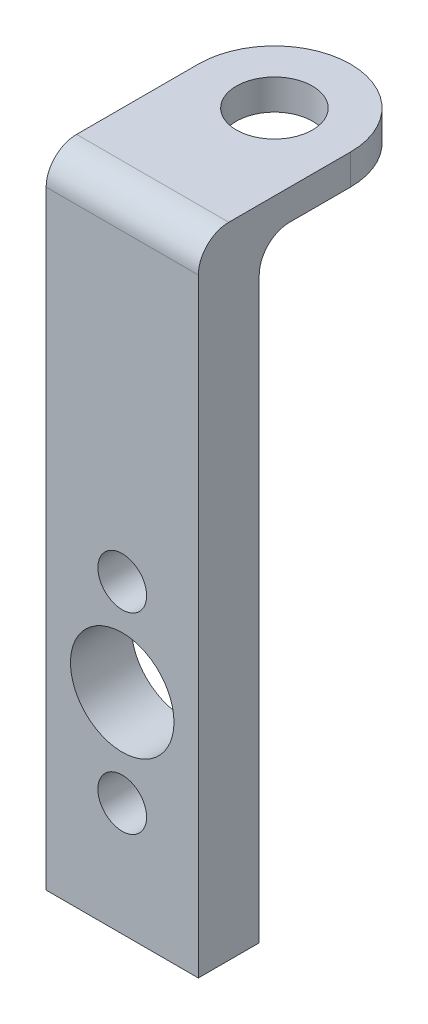
ISO-10303-21;
HEADER;
FILE_DESCRIPTION(('STEP AP214'),'2;1');
FILE_NAME('part.step','',(''),(''),'','','');
FILE_SCHEMA(('AUTOMOTIVE_DESIGN { 1 0 10303 214 1 1 1 1 }'));
ENDSEC;
DATA;
#1=APPLICATION_CONTEXT('core data for automotive mechanical design processes');
#2=APPLICATION_PROTOCOL_DEFINITION('international standard','automotive_design',2000,#1);
#3=PRODUCT_CONTEXT('',#1,'mechanical');
#4=PRODUCT('Part','Part','',(#3));
#5=PRODUCT_RELATED_PRODUCT_CATEGORY('part','',(#4));
#6=PRODUCT_DEFINITION_FORMATION('','',#4);
#7=PRODUCT_DEFINITION_CONTEXT('part definition',#1,'design');
#8=PRODUCT_DEFINITION('design','',#6,#7);
#9=PRODUCT_DEFINITION_SHAPE('','',#8);
#10=(LENGTH_UNIT() NAMED_UNIT(*) SI_UNIT(.MILLI.,.METRE.));
#11=(NAMED_UNIT(*) PLANE_ANGLE_UNIT() SI_UNIT($,.RADIAN.));
#12=(NAMED_UNIT(*) SI_UNIT($,.STERADIAN.) SOLID_ANGLE_UNIT());
#13=UNCERTAINTY_MEASURE_WITH_UNIT(LENGTH_MEASURE(1.E-05),#10,'distance_accuracy_value','');
#14=(GEOMETRIC_REPRESENTATION_CONTEXT(3) GLOBAL_UNCERTAINTY_ASSIGNED_CONTEXT((#13)) GLOBAL_UNIT_ASSIGNED_CONTEXT((#10,
#11,#12)) REPRESENTATION_CONTEXT('',''));
#15=CARTESIAN_POINT('',(0.,0.,0.));
#16=DIRECTION('',(0.,0.,1.));
#17=DIRECTION('',(1.,0.,0.));
#18=AXIS2_PLACEMENT_3D('',#15,#16,#17);
#19=CARTESIAN_POINT('',(0.,2.54,0.));
#20=DIRECTION('',(0.,-1.,0.));
#21=DIRECTION('',(0.,0.,-1.));
#22=AXIS2_PLACEMENT_3D('',#19,#20,#21);
#23=PLANE('',#22);
#24=DIRECTION('',(0.,0.,1.));
#25=VECTOR('',#24,1.);
#26=CARTESIAN_POINT('',(-6.35,2.54,0.));
#27=LINE('',#26,#25);
#28=CARTESIAN_POINT('',(-6.35,2.54,0.));
#29=VERTEX_POINT('',#28);
#30=CARTESIAN_POINT('',(-6.35,2.54,10.16));
#31=VERTEX_POINT('',#30);
#32=EDGE_CURVE('E178',#29,#31,#27,.T.);
#33=ORIENTED_EDGE('',*,*,#32,.T.);
#34=DIRECTION('',(1.,0.,0.));
#35=VECTOR('',#34,1.);
#36=CARTESIAN_POINT('',(0.,2.54,10.16));
#37=LINE('',#36,#35);
#38=CARTESIAN_POINT('',(6.35,2.54,10.16));
#39=VERTEX_POINT('',#38);
#40=EDGE_CURVE('E136',#31,#39,#37,.T.);
#41=ORIENTED_EDGE('',*,*,#40,.T.);
#42=DIRECTION('',(0.,0.,-1.));
#43=VECTOR('',#42,1.);
#44=CARTESIAN_POINT('',(6.35,2.54,0.));
#45=LINE('',#44,#43);
#46=CARTESIAN_POINT('',(6.35,2.54,0.));
#47=VERTEX_POINT('',#46);
#48=EDGE_CURVE('E163',#39,#47,#45,.T.);
#49=ORIENTED_EDGE('',*,*,#48,.T.);
#50=CARTESIAN_POINT('',(0.,2.54,0.));
#51=DIRECTION('',(0.,1.,0.));
#52=DIRECTION('',(0.,0.,-1.));
#53=AXIS2_PLACEMENT_3D('',#50,#51,#52);
#54=CIRCLE('',#53,6.35);
#55=EDGE_CURVE('E151',#47,#29,#54,.T.);
#56=ORIENTED_EDGE('',*,*,#55,.T.);
#57=EDGE_LOOP('',(#33,#41,#49,#56));
#58=FACE_BOUND('',#57,.T.);
#59=CARTESIAN_POINT('',(0.,2.54,0.));
#60=DIRECTION('',(0.,1.,0.));
#61=DIRECTION('',(0.,0.,1.));
#62=AXIS2_PLACEMENT_3D('',#59,#60,#61);
#63=CIRCLE('',#62,3.175);
#64=CARTESIAN_POINT('',(0.,2.54,3.175));
#65=VERTEX_POINT('',#64);
#66=EDGE_CURVE('E128',#65,#65,#63,.T.);
#67=ORIENTED_EDGE('',*,*,#66,.F.);
#68=EDGE_LOOP('',(#67));
#69=FACE_BOUND('',#68,.T.);
#70=ADVANCED_FACE('F35',(#58,#69),#23,.F.);
#71=CARTESIAN_POINT('',(0.,0.,0.));
#72=DIRECTION('',(0.,-1.,0.));
#73=DIRECTION('',(0.,0.,-1.));
#74=AXIS2_PLACEMENT_3D('',#71,#72,#73);
#75=PLANE('',#74);
#76=DIRECTION('',(0.,0.,-1.));
#77=VECTOR('',#76,1.);
#78=CARTESIAN_POINT('',(6.35,0.,0.));
#79=LINE('',#78,#77);
#80=CARTESIAN_POINT('',(6.35,0.,5.08));
#81=VERTEX_POINT('',#80);
#82=CARTESIAN_POINT('',(6.35,0.,0.));
#83=VERTEX_POINT('',#82);
#84=EDGE_CURVE('E148',#81,#83,#79,.T.);
#85=ORIENTED_EDGE('',*,*,#84,.F.);
#86=DIRECTION('',(1.,0.,0.));
#87=VECTOR('',#86,1.);
#88=CARTESIAN_POINT('',(0.,0.,5.08));
#89=LINE('',#88,#87);
#90=CARTESIAN_POINT('',(-6.35,0.,5.08));
#91=VERTEX_POINT('',#90);
#92=EDGE_CURVE('E58',#81,#91,#89,.F.);
#93=ORIENTED_EDGE('',*,*,#92,.T.);
#94=DIRECTION('',(0.,0.,1.));
#95=VECTOR('',#94,1.);
#96=CARTESIAN_POINT('',(-6.35,0.,0.));
#97=LINE('',#96,#95);
#98=CARTESIAN_POINT('',(-6.35,0.,0.));
#99=VERTEX_POINT('',#98);
#100=EDGE_CURVE('E152',#99,#91,#97,.T.);
#101=ORIENTED_EDGE('',*,*,#100,.F.);
#102=CARTESIAN_POINT('',(0.,0.,0.));
#103=DIRECTION('',(0.,1.,0.));
#104=DIRECTION('',(0.,0.,-1.));
#105=AXIS2_PLACEMENT_3D('',#102,#103,#104);
#106=CIRCLE('',#105,6.35);
#107=EDGE_CURVE('E169',#83,#99,#106,.T.);
#108=ORIENTED_EDGE('',*,*,#107,.F.);
#109=EDGE_LOOP('',(#85,#93,#101,#108));
#110=FACE_BOUND('',#109,.T.);
#111=CARTESIAN_POINT('',(0.,0.,0.));
#112=DIRECTION('',(0.,1.,0.));
#113=DIRECTION('',(0.,0.,1.));
#114=AXIS2_PLACEMENT_3D('',#111,#112,#113);
#115=CIRCLE('',#114,3.175);
#116=CARTESIAN_POINT('',(0.,0.,3.175));
#117=VERTEX_POINT('',#116);
#118=EDGE_CURVE('E125',#117,#117,#115,.T.);
#119=ORIENTED_EDGE('',*,*,#118,.T.);
#120=EDGE_LOOP('',(#119));
#121=FACE_BOUND('',#120,.T.);
#122=ADVANCED_FACE('F212',(#110,#121),#75,.T.);
#123=CARTESIAN_POINT('',(0.,2.54,0.));
#124=DIRECTION('',(0.,-1.,0.));
#125=DIRECTION('',(0.,0.,-1.));
#126=AXIS2_PLACEMENT_3D('',#123,#124,#125);
#127=CYLINDRICAL_SURFACE('',#126,6.35);
#128=ORIENTED_EDGE('',*,*,#107,.T.);
#129=DIRECTION('',(0.,-1.,0.));
#130=VECTOR('',#129,1.);
#131=CARTESIAN_POINT('',(-6.35,2.54,0.));
#132=LINE('',#131,#130);
#133=EDGE_CURVE('E140',#29,#99,#132,.T.);
#134=ORIENTED_EDGE('',*,*,#133,.F.);
#135=ORIENTED_EDGE('',*,*,#55,.F.);
#136=DIRECTION('',(0.,-1.,0.));
#137=VECTOR('',#136,1.);
#138=CARTESIAN_POINT('',(6.35,2.54,0.));
#139=LINE('',#138,#137);
#140=EDGE_CURVE('E159',#47,#83,#139,.T.);
#141=ORIENTED_EDGE('',*,*,#140,.T.);
#142=EDGE_LOOP('',(#128,#134,#135,#141));
#143=FACE_BOUND('',#142,.T.);
#144=ADVANCED_FACE('F218',(#143),#127,.T.);
#145=CARTESIAN_POINT('',(-6.35,2.54,0.));
#146=DIRECTION('',(1.,0.,0.));
#147=DIRECTION('',(0.,0.,-1.));
#148=AXIS2_PLACEMENT_3D('',#145,#146,#147);
#149=PLANE('',#148);
#150=DIRECTION('',(0.,-1.,0.));
#151=VECTOR('',#150,1.);
#152=CARTESIAN_POINT('',(-6.35,2.54,12.7));
#153=LINE('',#152,#151);
#154=CARTESIAN_POINT('',(-6.35,0.,12.7));
#155=VERTEX_POINT('',#154);
#156=CARTESIAN_POINT('',(-6.35,-50.8,12.7));
#157=VERTEX_POINT('',#156);
#158=EDGE_CURVE('E165',#155,#157,#153,.T.);
#159=ORIENTED_EDGE('',*,*,#158,.F.);
#160=CARTESIAN_POINT('',(-6.35,0.,10.16));
#161=DIRECTION('',(1.,0.,0.));
#162=DIRECTION('',(0.,0.,-1.));
#163=AXIS2_PLACEMENT_3D('',#160,#161,#162);
#164=CIRCLE('',#163,2.54);
#165=EDGE_CURVE('E144',#155,#31,#164,.F.);
#166=ORIENTED_EDGE('',*,*,#165,.T.);
#167=ORIENTED_EDGE('',*,*,#32,.F.);
#168=ORIENTED_EDGE('',*,*,#133,.T.);
#169=ORIENTED_EDGE('',*,*,#100,.T.);
#170=CARTESIAN_POINT('',(-6.35,-2.54,5.08));
#171=DIRECTION('',(1.,0.,0.));
#172=DIRECTION('',(0.,0.,-1.));
#173=AXIS2_PLACEMENT_3D('',#170,#171,#172);
#174=CIRCLE('',#173,2.54);
#175=CARTESIAN_POINT('',(-6.35,-2.54,7.62));
#176=VERTEX_POINT('',#175);
#177=EDGE_CURVE('E11',#91,#176,#174,.T.);
#178=ORIENTED_EDGE('',*,*,#177,.T.);
#179=DIRECTION('',(0.,1.,0.));
#180=VECTOR('',#179,1.);
#181=CARTESIAN_POINT('',(-6.35,-50.8,7.62));
#182=LINE('',#181,#180);
#183=CARTESIAN_POINT('',(-6.35,-50.8,7.62));
#184=VERTEX_POINT('',#183);
#185=EDGE_CURVE('E105',#184,#176,#182,.T.);
#186=ORIENTED_EDGE('',*,*,#185,.F.);
#187=DIRECTION('',(0.,0.,-1.));
#188=VECTOR('',#187,1.);
#189=CARTESIAN_POINT('',(-6.35,-50.8,12.7));
#190=LINE('',#189,#188);
#191=EDGE_CURVE('E112',#157,#184,#190,.T.);
#192=ORIENTED_EDGE('',*,*,#191,.F.);
#193=EDGE_LOOP('',(#159,#166,#167,#168,#169,#178,#186,#192));
#194=FACE_BOUND('',#193,.T.);
#195=ADVANCED_FACE('F123',(#194),#149,.F.);
#196=CARTESIAN_POINT('',(-6.35,2.54,12.7));
#197=DIRECTION('',(0.,0.,-1.));
#198=DIRECTION('',(-1.,0.,0.));
#199=AXIS2_PLACEMENT_3D('',#196,#197,#198);
#200=PLANE('',#199);
#201=CARTESIAN_POINT('',(0.,-41.3385,12.7));
#202=DIRECTION('',(0.,0.,1.));
#203=DIRECTION('',(-1.,0.,0.));
#204=AXIS2_PLACEMENT_3D('',#201,#202,#203);
#205=CIRCLE('',#204,2.032);
#206=CARTESIAN_POINT('',(-2.032,-41.3385,12.7));
#207=VERTEX_POINT('',#206);
#208=EDGE_CURVE('E192',#207,#207,#205,.T.);
#209=ORIENTED_EDGE('',*,*,#208,.F.);
#210=EDGE_LOOP('',(#209));
#211=FACE_BOUND('',#210,.T.);
#212=CARTESIAN_POINT('',(0.,-33.3375,12.7));
#213=DIRECTION('',(0.,0.,1.));
#214=DIRECTION('',(1.,0.,0.));
#215=AXIS2_PLACEMENT_3D('',#212,#213,#214);
#216=CIRCLE('',#215,4.318);
#217=CARTESIAN_POINT('',(4.318,-33.3375,12.7));
#218=VERTEX_POINT('',#217);
#219=EDGE_CURVE('E189',#218,#218,#216,.T.);
#220=ORIENTED_EDGE('',*,*,#219,.F.);
#221=EDGE_LOOP('',(#220));
#222=FACE_BOUND('',#221,.T.);
#223=CARTESIAN_POINT('',(0.,-25.3365,12.7));
#224=DIRECTION('',(0.,0.,1.));
#225=DIRECTION('',(1.,0.,0.));
#226=AXIS2_PLACEMENT_3D('',#223,#224,#225);
#227=CIRCLE('',#226,2.032);
#228=CARTESIAN_POINT('',(2.032,-25.3365,12.7));
#229=VERTEX_POINT('',#228);
#230=EDGE_CURVE('E185',#229,#229,#227,.T.);
#231=ORIENTED_EDGE('',*,*,#230,.F.);
#232=EDGE_LOOP('',(#231));
#233=FACE_BOUND('',#232,.T.);
#234=DIRECTION('',(0.,-1.,0.));
#235=VECTOR('',#234,1.);
#236=CARTESIAN_POINT('',(6.35,2.54,12.7));
#237=LINE('',#236,#235);
#238=CARTESIAN_POINT('',(6.35,0.,12.7));
#239=VERTEX_POINT('',#238);
#240=CARTESIAN_POINT('',(6.35,-50.8,12.7));
#241=VERTEX_POINT('',#240);
#242=EDGE_CURVE('E162',#239,#241,#237,.T.);
#243=ORIENTED_EDGE('',*,*,#242,.F.);
#244=DIRECTION('',(1.,0.,0.));
#245=VECTOR('',#244,1.);
#246=CARTESIAN_POINT('',(-6.35,0.,12.7));
#247=LINE('',#246,#245);
#248=EDGE_CURVE('E142',#239,#155,#247,.F.);
#249=ORIENTED_EDGE('',*,*,#248,.T.);
#250=ORIENTED_EDGE('',*,*,#158,.T.);
#251=DIRECTION('',(-1.,0.,0.));
#252=VECTOR('',#251,1.);
#253=CARTESIAN_POINT('',(-6.35,-50.8,12.7));
#254=LINE('',#253,#252);
#255=EDGE_CURVE('E118',#241,#157,#254,.T.);
#256=ORIENTED_EDGE('',*,*,#255,.F.);
#257=EDGE_LOOP('',(#243,#249,#250,#256));
#258=FACE_BOUND('',#257,.T.);
#259=ADVANCED_FACE('F228',(#211,#222,#233,#258),#200,.F.);
#260=CARTESIAN_POINT('',(6.35,2.54,0.));
#261=DIRECTION('',(-1.,0.,0.));
#262=DIRECTION('',(0.,0.,1.));
#263=AXIS2_PLACEMENT_3D('',#260,#261,#262);
#264=PLANE('',#263);
#265=ORIENTED_EDGE('',*,*,#48,.F.);
#266=CARTESIAN_POINT('',(6.35,0.,10.16));
#267=DIRECTION('',(-1.,0.,0.));
#268=DIRECTION('',(0.,0.,1.));
#269=AXIS2_PLACEMENT_3D('',#266,#267,#268);
#270=CIRCLE('',#269,2.54);
#271=EDGE_CURVE('E139',#39,#239,#270,.F.);
#272=ORIENTED_EDGE('',*,*,#271,.T.);
#273=ORIENTED_EDGE('',*,*,#242,.T.);
#274=DIRECTION('',(0.,0.,1.));
#275=VECTOR('',#274,1.);
#276=CARTESIAN_POINT('',(6.35,-50.8,12.7));
#277=LINE('',#276,#275);
#278=CARTESIAN_POINT('',(6.35,-50.8,7.62));
#279=VERTEX_POINT('',#278);
#280=EDGE_CURVE('E111',#279,#241,#277,.T.);
#281=ORIENTED_EDGE('',*,*,#280,.F.);
#282=DIRECTION('',(0.,1.,0.));
#283=VECTOR('',#282,1.);
#284=CARTESIAN_POINT('',(6.35,-50.8,7.62));
#285=LINE('',#284,#283);
#286=CARTESIAN_POINT('',(6.35,-2.54,7.62));
#287=VERTEX_POINT('',#286);
#288=EDGE_CURVE('E107',#279,#287,#285,.T.);
#289=ORIENTED_EDGE('',*,*,#288,.T.);
#290=CARTESIAN_POINT('',(6.35,-2.54,5.08));
#291=DIRECTION('',(-1.,0.,0.));
#292=DIRECTION('',(0.,0.,1.));
#293=AXIS2_PLACEMENT_3D('',#290,#291,#292);
#294=CIRCLE('',#293,2.54);
#295=EDGE_CURVE('E44',#287,#81,#294,.T.);
#296=ORIENTED_EDGE('',*,*,#295,.T.);
#297=ORIENTED_EDGE('',*,*,#84,.T.);
#298=ORIENTED_EDGE('',*,*,#140,.F.);
#299=EDGE_LOOP('',(#265,#272,#273,#281,#289,#296,#297,#298));
#300=FACE_BOUND('',#299,.T.);
#301=ADVANCED_FACE('F225',(#300),#264,.F.);
#302=CARTESIAN_POINT('',(0.,2.54,0.));
#303=DIRECTION('',(0.,-1.,0.));
#304=DIRECTION('',(0.,0.,-1.));
#305=AXIS2_PLACEMENT_3D('',#302,#303,#304);
#306=CYLINDRICAL_SURFACE('',#305,3.175);
#307=ORIENTED_EDGE('',*,*,#66,.T.);
#308=EDGE_LOOP('',(#307));
#309=FACE_BOUND('',#308,.T.);
#310=ORIENTED_EDGE('',*,*,#118,.F.);
#311=EDGE_LOOP('',(#310));
#312=FACE_BOUND('',#311,.T.);
#313=ADVANCED_FACE('F222',(#309,#312),#306,.F.);
#314=CARTESIAN_POINT('',(-6.35,-50.8,7.62));
#315=DIRECTION('',(0.,0.,1.));
#316=DIRECTION('',(1.,0.,0.));
#317=AXIS2_PLACEMENT_3D('',#314,#315,#316);
#318=PLANE('',#317);
#319=CARTESIAN_POINT('',(0.,-41.3385,7.62));
#320=DIRECTION('',(0.,0.,1.));
#321=DIRECTION('',(1.,0.,0.));
#322=AXIS2_PLACEMENT_3D('',#319,#320,#321);
#323=CIRCLE('',#322,2.032);
#324=CARTESIAN_POINT('',(2.032,-41.3385,7.62));
#325=VERTEX_POINT('',#324);
#326=EDGE_CURVE('E39',#325,#325,#323,.T.);
#327=ORIENTED_EDGE('',*,*,#326,.T.);
#328=EDGE_LOOP('',(#327));
#329=FACE_BOUND('',#328,.T.);
#330=CARTESIAN_POINT('',(0.,-33.3375,7.62));
#331=DIRECTION('',(0.,0.,1.));
#332=DIRECTION('',(1.,0.,0.));
#333=AXIS2_PLACEMENT_3D('',#330,#331,#332);
#334=CIRCLE('',#333,4.318);
#335=CARTESIAN_POINT('',(4.318,-33.3375,7.62));
#336=VERTEX_POINT('',#335);
#337=EDGE_CURVE('E188',#336,#336,#334,.T.);
#338=ORIENTED_EDGE('',*,*,#337,.T.);
#339=EDGE_LOOP('',(#338));
#340=FACE_BOUND('',#339,.T.);
#341=CARTESIAN_POINT('',(0.,-25.3365,7.62));
#342=DIRECTION('',(0.,0.,1.));
#343=DIRECTION('',(1.,0.,0.));
#344=AXIS2_PLACEMENT_3D('',#341,#342,#343);
#345=CIRCLE('',#344,2.032);
#346=CARTESIAN_POINT('',(2.032,-25.3365,7.62));
#347=VERTEX_POINT('',#346);
#348=EDGE_CURVE('E121',#347,#347,#345,.T.);
#349=ORIENTED_EDGE('',*,*,#348,.T.);
#350=EDGE_LOOP('',(#349));
#351=FACE_BOUND('',#350,.T.);
#352=ORIENTED_EDGE('',*,*,#185,.T.);
#353=DIRECTION('',(1.,0.,0.));
#354=VECTOR('',#353,1.);
#355=CARTESIAN_POINT('',(-6.35,-2.54,7.62));
#356=LINE('',#355,#354);
#357=EDGE_CURVE('E146',#176,#287,#356,.T.);
#358=ORIENTED_EDGE('',*,*,#357,.T.);
#359=ORIENTED_EDGE('',*,*,#288,.F.);
#360=DIRECTION('',(1.,0.,0.));
#361=VECTOR('',#360,1.);
#362=CARTESIAN_POINT('',(-6.35,-50.8,7.62));
#363=LINE('',#362,#361);
#364=EDGE_CURVE('E100',#184,#279,#363,.T.);
#365=ORIENTED_EDGE('',*,*,#364,.F.);
#366=EDGE_LOOP('',(#352,#358,#359,#365));
#367=FACE_BOUND('',#366,.T.);
#368=ADVANCED_FACE('F102',(#329,#340,#351,#367),#318,.F.);
#369=CARTESIAN_POINT('',(0.,-50.8,0.));
#370=DIRECTION('',(0.,-1.,0.));
#371=DIRECTION('',(0.,0.,-1.));
#372=AXIS2_PLACEMENT_3D('',#369,#370,#371);
#373=PLANE('',#372);
#374=ORIENTED_EDGE('',*,*,#191,.T.);
#375=ORIENTED_EDGE('',*,*,#364,.T.);
#376=ORIENTED_EDGE('',*,*,#280,.T.);
#377=ORIENTED_EDGE('',*,*,#255,.T.);
#378=EDGE_LOOP('',(#374,#375,#376,#377));
#379=FACE_BOUND('',#378,.T.);
#380=ADVANCED_FACE('F116',(#379),#373,.T.);
#381=CARTESIAN_POINT('',(0.,0.,10.16));
#382=DIRECTION('',(1.,0.,0.));
#383=DIRECTION('',(0.,0.,-1.));
#384=AXIS2_PLACEMENT_3D('',#381,#382,#383);
#385=CYLINDRICAL_SURFACE('',#384,2.54);
#386=ORIENTED_EDGE('',*,*,#165,.F.);
#387=ORIENTED_EDGE('',*,*,#248,.F.);
#388=ORIENTED_EDGE('',*,*,#271,.F.);
#389=ORIENTED_EDGE('',*,*,#40,.F.);
#390=EDGE_LOOP('',(#386,#387,#388,#389));
#391=FACE_BOUND('',#390,.T.);
#392=ADVANCED_FACE('F235',(#391),#385,.T.);
#393=CARTESIAN_POINT('',(-6.35,-2.54,5.08));
#394=DIRECTION('',(1.,0.,0.));
#395=DIRECTION('',(0.,0.,-1.));
#396=AXIS2_PLACEMENT_3D('',#393,#394,#395);
#397=CYLINDRICAL_SURFACE('',#396,2.54);
#398=ORIENTED_EDGE('',*,*,#177,.F.);
#399=ORIENTED_EDGE('',*,*,#92,.F.);
#400=ORIENTED_EDGE('',*,*,#295,.F.);
#401=ORIENTED_EDGE('',*,*,#357,.F.);
#402=EDGE_LOOP('',(#398,#399,#400,#401));
#403=FACE_BOUND('',#402,.T.);
#404=ADVANCED_FACE('F37',(#403),#397,.F.);
#405=CARTESIAN_POINT('',(0.,-25.3365,-6.35));
#406=DIRECTION('',(0.,0.,1.));
#407=DIRECTION('',(1.,0.,0.));
#408=AXIS2_PLACEMENT_3D('',#405,#406,#407);
#409=CYLINDRICAL_SURFACE('',#408,2.032);
#410=ORIENTED_EDGE('',*,*,#230,.T.);
#411=EDGE_LOOP('',(#410));
#412=FACE_BOUND('',#411,.T.);
#413=ORIENTED_EDGE('',*,*,#348,.F.);
#414=EDGE_LOOP('',(#413));
#415=FACE_BOUND('',#414,.T.);
#416=ADVANCED_FACE('F208',(#412,#415),#409,.F.);
#417=CARTESIAN_POINT('',(0.,-33.3375,-6.35));
#418=DIRECTION('',(0.,0.,1.));
#419=DIRECTION('',(1.,0.,0.));
#420=AXIS2_PLACEMENT_3D('',#417,#418,#419);
#421=CYLINDRICAL_SURFACE('',#420,4.318);
#422=ORIENTED_EDGE('',*,*,#219,.T.);
#423=EDGE_LOOP('',(#422));
#424=FACE_BOUND('',#423,.T.);
#425=ORIENTED_EDGE('',*,*,#337,.F.);
#426=EDGE_LOOP('',(#425));
#427=FACE_BOUND('',#426,.T.);
#428=ADVANCED_FACE('F203',(#424,#427),#421,.F.);
#429=CARTESIAN_POINT('',(0.,-41.3385,-6.35));
#430=DIRECTION('',(0.,0.,1.));
#431=DIRECTION('',(1.,0.,0.));
#432=AXIS2_PLACEMENT_3D('',#429,#430,#431);
#433=CYLINDRICAL_SURFACE('',#432,2.032);
#434=ORIENTED_EDGE('',*,*,#208,.T.);
#435=EDGE_LOOP('',(#434));
#436=FACE_BOUND('',#435,.T.);
#437=ORIENTED_EDGE('',*,*,#326,.F.);
#438=EDGE_LOOP('',(#437));
#439=FACE_BOUND('',#438,.T.);
#440=ADVANCED_FACE('F201',(#436,#439),#433,.F.);
#441=CLOSED_SHELL('',(#70,#122,#144,#195,#259,#301,#313,#368,#380,#392,#404,#416,#428,#440));
#442=MANIFOLD_SOLID_BREP('B2',#441);
#443=ADVANCED_BREP_SHAPE_REPRESENTATION('',(#18,#442),#14);
#444=SHAPE_DEFINITION_REPRESENTATION(#9,#443);
ENDSEC;
END-ISO-10303-21;
